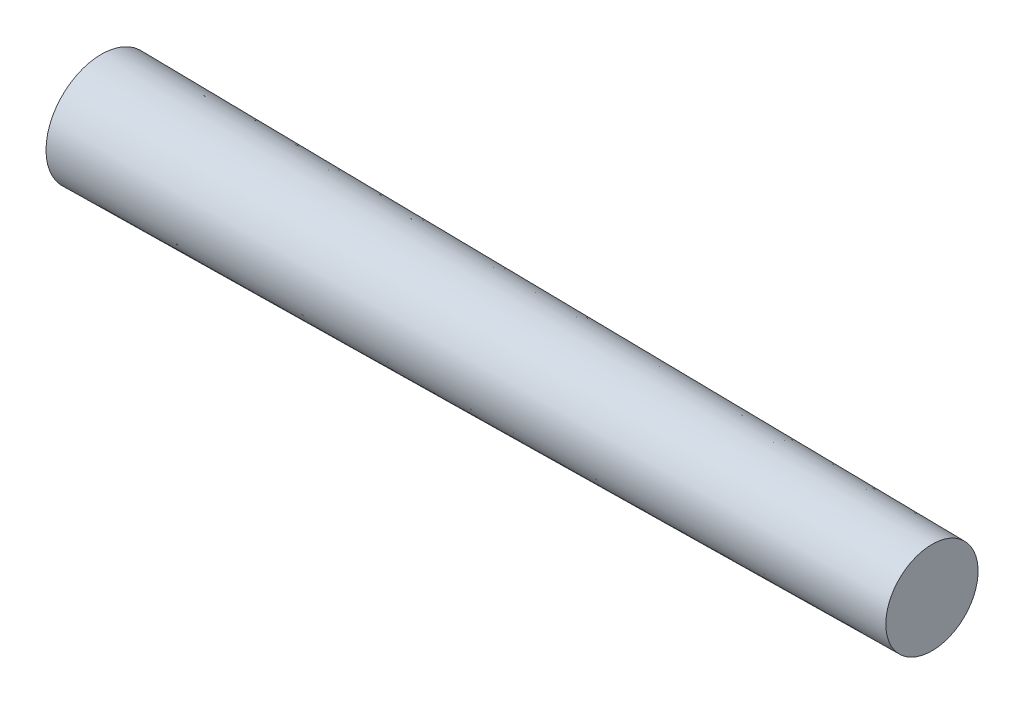
ISO-10303-21;
HEADER;
FILE_DESCRIPTION(('STEP AP214'),'2;1');
FILE_NAME('part.step','',(''),(''),'','','');
FILE_SCHEMA(('AUTOMOTIVE_DESIGN { 1 0 10303 214 1 1 1 1 }'));
ENDSEC;
DATA;
#1=APPLICATION_CONTEXT('core data for automotive mechanical design processes');
#2=APPLICATION_PROTOCOL_DEFINITION('international standard','automotive_design',2000,#1);
#3=PRODUCT_CONTEXT('',#1,'mechanical');
#4=PRODUCT('Part','Part','',(#3));
#5=PRODUCT_RELATED_PRODUCT_CATEGORY('part','',(#4));
#6=PRODUCT_DEFINITION_FORMATION('','',#4);
#7=PRODUCT_DEFINITION_CONTEXT('part definition',#1,'design');
#8=PRODUCT_DEFINITION('design','',#6,#7);
#9=PRODUCT_DEFINITION_SHAPE('','',#8);
#10=(LENGTH_UNIT() NAMED_UNIT(*) SI_UNIT(.MILLI.,.METRE.));
#11=(NAMED_UNIT(*) PLANE_ANGLE_UNIT() SI_UNIT($,.RADIAN.));
#12=(NAMED_UNIT(*) SI_UNIT($,.STERADIAN.) SOLID_ANGLE_UNIT());
#13=UNCERTAINTY_MEASURE_WITH_UNIT(LENGTH_MEASURE(1.E-05),#10,'distance_accuracy_value','');
#14=(GEOMETRIC_REPRESENTATION_CONTEXT(3) GLOBAL_UNCERTAINTY_ASSIGNED_CONTEXT((#13)) GLOBAL_UNIT_ASSIGNED_CONTEXT((#10,
#11,#12)) REPRESENTATION_CONTEXT('',''));
#15=CARTESIAN_POINT('',(0.,0.,0.));
#16=DIRECTION('',(0.,0.,1.));
#17=DIRECTION('',(1.,0.,0.));
#18=AXIS2_PLACEMENT_3D('',#15,#16,#17);
#19=CARTESIAN_POINT('',(0.,0.,0.));
#20=DIRECTION('',(1.,0.,0.));
#21=DIRECTION('',(0.,0.,-1.));
#22=AXIS2_PLACEMENT_3D('',#19,#20,#21);
#23=PLANE('',#22);
#24=CARTESIAN_POINT('',(0.,0.,0.));
#25=DIRECTION('',(-1.,0.,0.));
#26=DIRECTION('',(0.,0.,1.));
#27=AXIS2_PLACEMENT_3D('',#24,#25,#26);
#28=CIRCLE('',#27,3.);
#29=CARTESIAN_POINT('',(0.,0.,3.));
#30=VERTEX_POINT('',#29);
#31=EDGE_CURVE('E10',#30,#30,#28,.T.);
#32=ORIENTED_EDGE('',*,*,#31,.T.);
#33=EDGE_LOOP('',(#32));
#34=FACE_BOUND('',#33,.T.);
#35=ADVANCED_FACE('F39',(#34),#23,.F.);
#36=CARTESIAN_POINT('',(45.,0.,0.));
#37=DIRECTION('',(-1.,0.,0.));
#38=DIRECTION('',(0.,0.,1.));
#39=AXIS2_PLACEMENT_3D('',#36,#37,#38);
#40=CONICAL_SURFACE('',#39,2.5,0.0111106538976075);
#41=ORIENTED_EDGE('',*,*,#31,.F.);
#42=EDGE_LOOP('',(#41));
#43=FACE_BOUND('',#42,.T.);
#44=CARTESIAN_POINT('',(45.,0.,0.));
#45=DIRECTION('',(-1.,0.,0.));
#46=DIRECTION('',(0.,0.,1.));
#47=AXIS2_PLACEMENT_3D('',#44,#45,#46);
#48=CIRCLE('',#47,2.5);
#49=CARTESIAN_POINT('',(45.,0.,2.5));
#50=VERTEX_POINT('',#49);
#51=EDGE_CURVE('E44',#50,#50,#48,.T.);
#52=ORIENTED_EDGE('',*,*,#51,.T.);
#53=EDGE_LOOP('',(#52));
#54=FACE_BOUND('',#53,.T.);
#55=ADVANCED_FACE('F51',(#43,#54),#40,.T.);
#56=CARTESIAN_POINT('',(45.,2.5,0.));
#57=DIRECTION('',(-1.,0.,0.));
#58=DIRECTION('',(0.,0.,1.));
#59=AXIS2_PLACEMENT_3D('',#56,#57,#58);
#60=PLANE('',#59);
#61=ORIENTED_EDGE('',*,*,#51,.F.);
#62=EDGE_LOOP('',(#61));
#63=FACE_BOUND('',#62,.T.);
#64=ADVANCED_FACE('F52',(#63),#60,.F.);
#65=CLOSED_SHELL('',(#35,#55,#64));
#66=MANIFOLD_SOLID_BREP('B2',#65);
#67=ADVANCED_BREP_SHAPE_REPRESENTATION('',(#18,#66),#14);
#68=SHAPE_DEFINITION_REPRESENTATION(#9,#67);
ENDSEC;
END-ISO-10303-21;
